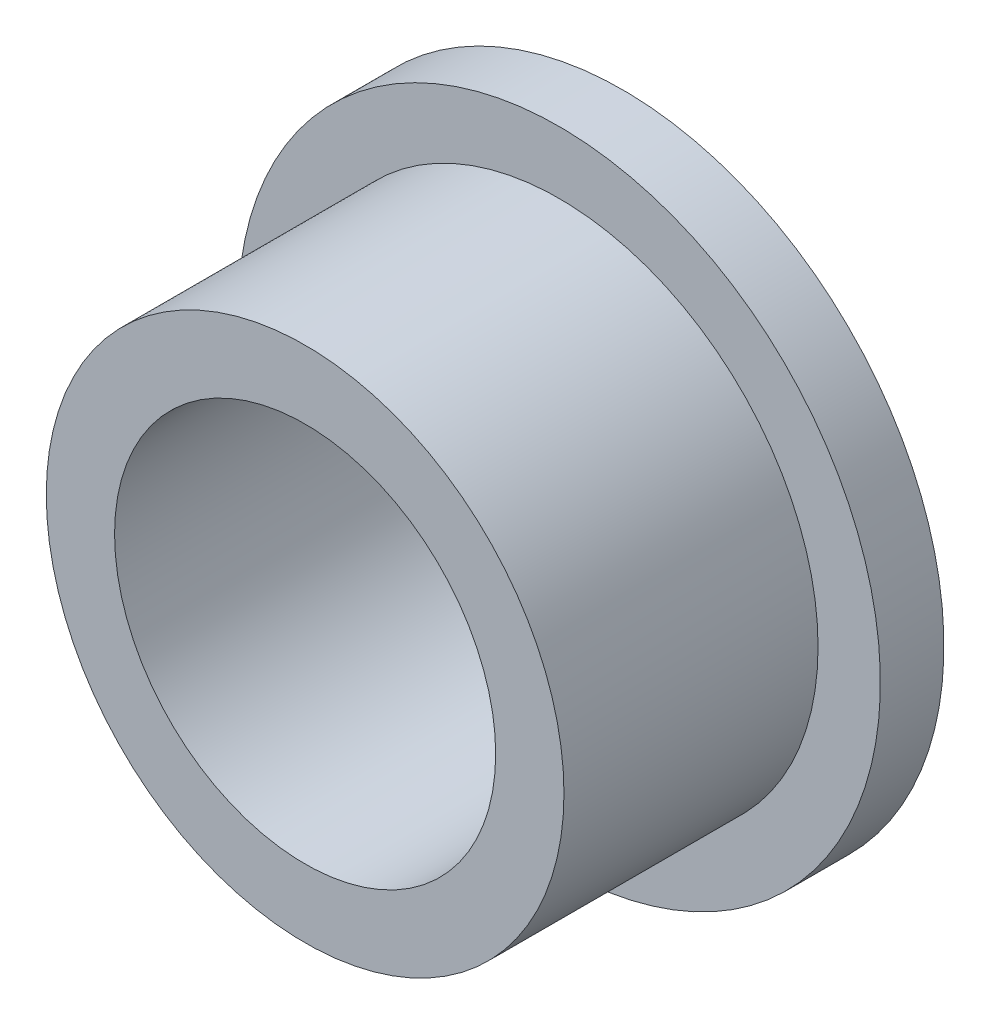
ISO-10303-21;
HEADER;
FILE_DESCRIPTION(('STEP AP214'),'2;1');
FILE_NAME('part.step','',(''),(''),'','','');
FILE_SCHEMA(('AUTOMOTIVE_DESIGN { 1 0 10303 214 1 1 1 1 }'));
ENDSEC;
DATA;
#1=APPLICATION_CONTEXT('core data for automotive mechanical design processes');
#2=APPLICATION_PROTOCOL_DEFINITION('international standard','automotive_design',2000,#1);
#3=PRODUCT_CONTEXT('',#1,'mechanical');
#4=PRODUCT('Part','Part','',(#3));
#5=PRODUCT_RELATED_PRODUCT_CATEGORY('part','',(#4));
#6=PRODUCT_DEFINITION_FORMATION('','',#4);
#7=PRODUCT_DEFINITION_CONTEXT('part definition',#1,'design');
#8=PRODUCT_DEFINITION('design','',#6,#7);
#9=PRODUCT_DEFINITION_SHAPE('','',#8);
#10=(LENGTH_UNIT() NAMED_UNIT(*) SI_UNIT(.MILLI.,.METRE.));
#11=(NAMED_UNIT(*) PLANE_ANGLE_UNIT() SI_UNIT($,.RADIAN.));
#12=(NAMED_UNIT(*) SI_UNIT($,.STERADIAN.) SOLID_ANGLE_UNIT());
#13=UNCERTAINTY_MEASURE_WITH_UNIT(LENGTH_MEASURE(1.E-05),#10,'distance_accuracy_value','');
#14=(GEOMETRIC_REPRESENTATION_CONTEXT(3) GLOBAL_UNCERTAINTY_ASSIGNED_CONTEXT((#13)) GLOBAL_UNIT_ASSIGNED_CONTEXT((#10,
#11,#12)) REPRESENTATION_CONTEXT('',''));
#15=CARTESIAN_POINT('',(0.,0.,0.));
#16=DIRECTION('',(0.,0.,1.));
#17=DIRECTION('',(1.,0.,0.));
#18=AXIS2_PLACEMENT_3D('',#15,#16,#17);
#19=CARTESIAN_POINT('',(0.,0.,5.));
#20=DIRECTION('',(0.,0.,-1.));
#21=DIRECTION('',(-1.,0.,0.));
#22=AXIS2_PLACEMENT_3D('',#19,#20,#21);
#23=CYLINDRICAL_SURFACE('',#22,4.075);
#24=CARTESIAN_POINT('',(0.,0.,5.));
#25=DIRECTION('',(0.,0.,1.));
#26=DIRECTION('',(1.,0.,0.));
#27=AXIS2_PLACEMENT_3D('',#24,#25,#26);
#28=CIRCLE('',#27,4.075);
#29=CARTESIAN_POINT('',(4.075,0.,5.));
#30=VERTEX_POINT('',#29);
#31=EDGE_CURVE('E45',#30,#30,#28,.T.);
#32=ORIENTED_EDGE('',*,*,#31,.F.);
#33=EDGE_LOOP('',(#32));
#34=FACE_BOUND('',#33,.T.);
#35=CARTESIAN_POINT('',(0.,0.,1.));
#36=DIRECTION('',(0.,0.,-1.));
#37=DIRECTION('',(-1.,0.,0.));
#38=AXIS2_PLACEMENT_3D('',#35,#36,#37);
#39=CIRCLE('',#38,4.075);
#40=CARTESIAN_POINT('',(-4.075,0.,1.));
#41=VERTEX_POINT('',#40);
#42=EDGE_CURVE('E10',#41,#41,#39,.T.);
#43=ORIENTED_EDGE('',*,*,#42,.F.);
#44=EDGE_LOOP('',(#43));
#45=FACE_BOUND('',#44,.T.);
#46=ADVANCED_FACE('F39',(#34,#45),#23,.T.);
#47=CARTESIAN_POINT('',(0.,0.,5.));
#48=DIRECTION('',(0.,0.,1.));
#49=DIRECTION('',(1.,0.,0.));
#50=AXIS2_PLACEMENT_3D('',#47,#48,#49);
#51=PLANE('',#50);
#52=ORIENTED_EDGE('',*,*,#31,.T.);
#53=EDGE_LOOP('',(#52));
#54=FACE_BOUND('',#53,.T.);
#55=CARTESIAN_POINT('',(0.,0.,5.));
#56=DIRECTION('',(0.,0.,1.));
#57=DIRECTION('',(1.,0.,0.));
#58=AXIS2_PLACEMENT_3D('',#55,#56,#57);
#59=CIRCLE('',#58,3.);
#60=CARTESIAN_POINT('',(3.,0.,5.));
#61=VERTEX_POINT('',#60);
#62=EDGE_CURVE('E49',#61,#61,#59,.T.);
#63=ORIENTED_EDGE('',*,*,#62,.F.);
#64=EDGE_LOOP('',(#63));
#65=FACE_BOUND('',#64,.T.);
#66=ADVANCED_FACE('F77',(#54,#65),#51,.T.);
#67=CARTESIAN_POINT('',(0.,0.,0.));
#68=DIRECTION('',(0.,0.,1.));
#69=DIRECTION('',(1.,0.,0.));
#70=AXIS2_PLACEMENT_3D('',#67,#68,#69);
#71=PLANE('',#70);
#72=CARTESIAN_POINT('',(0.,0.,0.));
#73=DIRECTION('',(0.,0.,1.));
#74=DIRECTION('',(1.,0.,0.));
#75=AXIS2_PLACEMENT_3D('',#72,#73,#74);
#76=CIRCLE('',#75,3.);
#77=CARTESIAN_POINT('',(3.,0.,0.));
#78=VERTEX_POINT('',#77);
#79=EDGE_CURVE('E53',#78,#78,#76,.T.);
#80=ORIENTED_EDGE('',*,*,#79,.T.);
#81=EDGE_LOOP('',(#80));
#82=FACE_BOUND('',#81,.T.);
#83=CARTESIAN_POINT('',(0.,0.,0.));
#84=DIRECTION('',(0.,0.,-1.));
#85=DIRECTION('',(-1.,0.,0.));
#86=AXIS2_PLACEMENT_3D('',#83,#84,#85);
#87=CIRCLE('',#86,5.05621879612568);
#88=CARTESIAN_POINT('',(-5.05621879612568,0.,0.));
#89=VERTEX_POINT('',#88);
#90=EDGE_CURVE('E59',#89,#89,#87,.T.);
#91=ORIENTED_EDGE('',*,*,#90,.T.);
#92=EDGE_LOOP('',(#91));
#93=FACE_BOUND('',#92,.T.);
#94=ADVANCED_FACE('F84',(#82,#93),#71,.F.);
#95=CARTESIAN_POINT('',(0.,0.,5.));
#96=DIRECTION('',(0.,0.,-1.));
#97=DIRECTION('',(-1.,0.,0.));
#98=AXIS2_PLACEMENT_3D('',#95,#96,#97);
#99=CYLINDRICAL_SURFACE('',#98,3.);
#100=ORIENTED_EDGE('',*,*,#62,.T.);
#101=EDGE_LOOP('',(#100));
#102=FACE_BOUND('',#101,.T.);
#103=ORIENTED_EDGE('',*,*,#79,.F.);
#104=EDGE_LOOP('',(#103));
#105=FACE_BOUND('',#104,.T.);
#106=ADVANCED_FACE('F74',(#102,#105),#99,.F.);
#107=CARTESIAN_POINT('',(0.,0.,1.));
#108=DIRECTION('',(0.,0.,-1.));
#109=DIRECTION('',(-1.,0.,0.));
#110=AXIS2_PLACEMENT_3D('',#107,#108,#109);
#111=CYLINDRICAL_SURFACE('',#110,5.05621879612568);
#112=CARTESIAN_POINT('',(0.,0.,1.));
#113=DIRECTION('',(0.,0.,-1.));
#114=DIRECTION('',(-1.,0.,0.));
#115=AXIS2_PLACEMENT_3D('',#112,#113,#114);
#116=CIRCLE('',#115,5.05621879612568);
#117=CARTESIAN_POINT('',(-5.05621879612568,0.,1.));
#118=VERTEX_POINT('',#117);
#119=EDGE_CURVE('E57',#118,#118,#116,.T.);
#120=ORIENTED_EDGE('',*,*,#119,.T.);
#121=EDGE_LOOP('',(#120));
#122=FACE_BOUND('',#121,.T.);
#123=ORIENTED_EDGE('',*,*,#90,.F.);
#124=EDGE_LOOP('',(#123));
#125=FACE_BOUND('',#124,.T.);
#126=ADVANCED_FACE('F65',(#122,#125),#111,.T.);
#127=CARTESIAN_POINT('',(0.,0.,1.));
#128=DIRECTION('',(0.,0.,-1.));
#129=DIRECTION('',(-1.,0.,0.));
#130=AXIS2_PLACEMENT_3D('',#127,#128,#129);
#131=PLANE('',#130);
#132=ORIENTED_EDGE('',*,*,#42,.T.);
#133=EDGE_LOOP('',(#132));
#134=FACE_BOUND('',#133,.T.);
#135=ORIENTED_EDGE('',*,*,#119,.F.);
#136=EDGE_LOOP('',(#135));
#137=FACE_BOUND('',#136,.T.);
#138=ADVANCED_FACE('F68',(#134,#137),#131,.F.);
#139=CLOSED_SHELL('',(#46,#66,#94,#106,#126,#138));
#140=MANIFOLD_SOLID_BREP('B2',#139);
#141=ADVANCED_BREP_SHAPE_REPRESENTATION('',(#18,#140),#14);
#142=SHAPE_DEFINITION_REPRESENTATION(#9,#141);
ENDSEC;
END-ISO-10303-21;
